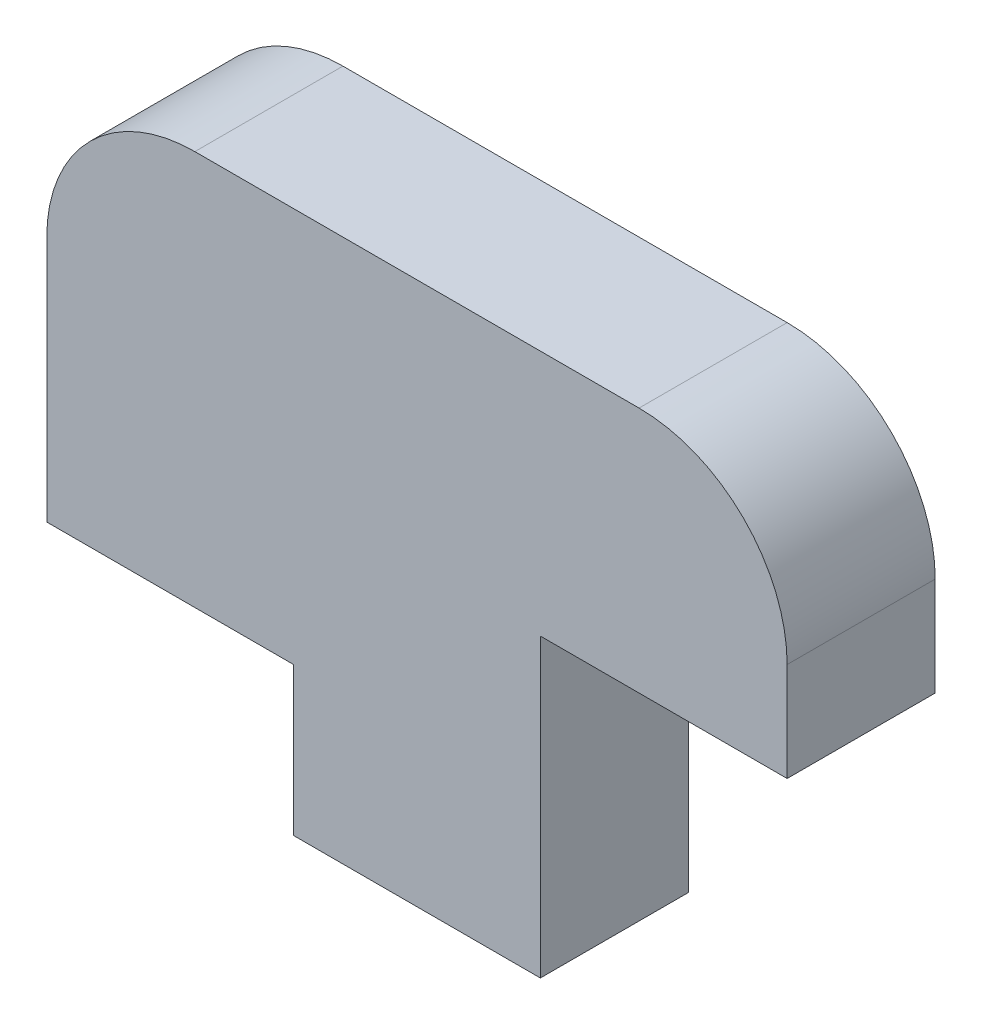
ISO-10303-21;
HEADER;
FILE_DESCRIPTION(('STEP AP214'),'2;1');
FILE_NAME('part.step','',(''),(''),'','','');
FILE_SCHEMA(('AUTOMOTIVE_DESIGN { 1 0 10303 214 1 1 1 1 }'));
ENDSEC;
DATA;
#1=APPLICATION_CONTEXT('core data for automotive mechanical design processes');
#2=APPLICATION_PROTOCOL_DEFINITION('international standard','automotive_design',2000,#1);
#3=PRODUCT_CONTEXT('',#1,'mechanical');
#4=PRODUCT('Part','Part','',(#3));
#5=PRODUCT_RELATED_PRODUCT_CATEGORY('part','',(#4));
#6=PRODUCT_DEFINITION_FORMATION('','',#4);
#7=PRODUCT_DEFINITION_CONTEXT('part definition',#1,'design');
#8=PRODUCT_DEFINITION('design','',#6,#7);
#9=PRODUCT_DEFINITION_SHAPE('','',#8);
#10=(LENGTH_UNIT() NAMED_UNIT(*) SI_UNIT(.MILLI.,.METRE.));
#11=(NAMED_UNIT(*) PLANE_ANGLE_UNIT() SI_UNIT($,.RADIAN.));
#12=(NAMED_UNIT(*) SI_UNIT($,.STERADIAN.) SOLID_ANGLE_UNIT());
#13=UNCERTAINTY_MEASURE_WITH_UNIT(LENGTH_MEASURE(1.E-05),#10,'distance_accuracy_value','');
#14=(GEOMETRIC_REPRESENTATION_CONTEXT(3) GLOBAL_UNCERTAINTY_ASSIGNED_CONTEXT((#13)) GLOBAL_UNIT_ASSIGNED_CONTEXT((#10,
#11,#12)) REPRESENTATION_CONTEXT('',''));
#15=CARTESIAN_POINT('',(0.,0.,0.));
#16=DIRECTION('',(0.,0.,1.));
#17=DIRECTION('',(1.,0.,0.));
#18=AXIS2_PLACEMENT_3D('',#15,#16,#17);
#19=CARTESIAN_POINT('',(-9.99999999999934,3.,3.));
#20=DIRECTION('',(1.,0.,0.));
#21=DIRECTION('',(0.,0.,-1.));
#22=AXIS2_PLACEMENT_3D('',#19,#20,#21);
#23=PLANE('',#22);
#24=DIRECTION('',(0.,-1.,0.));
#25=VECTOR('',#24,1.);
#26=CARTESIAN_POINT('',(-10.,3.,0.));
#27=LINE('',#26,#25);
#28=CARTESIAN_POINT('',(-10.,8.,0.));
#29=VERTEX_POINT('',#28);
#30=CARTESIAN_POINT('',(-10.,3.,0.));
#31=VERTEX_POINT('',#30);
#32=EDGE_CURVE('E138',#29,#31,#27,.T.);
#33=ORIENTED_EDGE('',*,*,#32,.T.);
#34=DIRECTION('',(0.,0.,-1.));
#35=VECTOR('',#34,1.);
#36=CARTESIAN_POINT('',(-9.99999999999934,3.,3.));
#37=LINE('',#36,#35);
#38=CARTESIAN_POINT('',(-9.99999999999934,3.,3.));
#39=VERTEX_POINT('',#38);
#40=EDGE_CURVE('E11',#39,#31,#37,.T.);
#41=ORIENTED_EDGE('',*,*,#40,.F.);
#42=DIRECTION('',(0.,-1.,0.));
#43=VECTOR('',#42,1.);
#44=CARTESIAN_POINT('',(-9.99999999999934,3.,3.));
#45=LINE('',#44,#43);
#46=CARTESIAN_POINT('',(-9.99999999999934,8.,3.));
#47=VERTEX_POINT('',#46);
#48=EDGE_CURVE('E156',#47,#39,#45,.T.);
#49=ORIENTED_EDGE('',*,*,#48,.F.);
#50=DIRECTION('',(0.,0.,-1.));
#51=VECTOR('',#50,1.);
#52=CARTESIAN_POINT('',(-9.99999999999934,8.,3.));
#53=LINE('',#52,#51);
#54=EDGE_CURVE('E134',#47,#29,#53,.T.);
#55=ORIENTED_EDGE('',*,*,#54,.T.);
#56=EDGE_LOOP('',(#33,#41,#49,#55));
#57=FACE_BOUND('',#56,.T.);
#58=ADVANCED_FACE('F30',(#57),#23,.F.);
#59=CARTESIAN_POINT('',(-9.99999999999934,3.,3.));
#60=DIRECTION('',(0.,1.,0.));
#61=DIRECTION('',(-1.,0.,0.));
#62=AXIS2_PLACEMENT_3D('',#59,#60,#61);
#63=PLANE('',#62);
#64=DIRECTION('',(1.,0.,0.));
#65=VECTOR('',#64,1.);
#66=CARTESIAN_POINT('',(-10.,3.,0.));
#67=LINE('',#66,#65);
#68=CARTESIAN_POINT('',(-4.99999999999989,3.,0.));
#69=VERTEX_POINT('',#68);
#70=EDGE_CURVE('E141',#31,#69,#67,.T.);
#71=ORIENTED_EDGE('',*,*,#70,.T.);
#72=DIRECTION('',(0.,0.,-1.));
#73=VECTOR('',#72,1.);
#74=CARTESIAN_POINT('',(-4.99999999999945,3.,3.));
#75=LINE('',#74,#73);
#76=CARTESIAN_POINT('',(-4.99999999999945,3.,3.));
#77=VERTEX_POINT('',#76);
#78=EDGE_CURVE('E38',#77,#69,#75,.T.);
#79=ORIENTED_EDGE('',*,*,#78,.F.);
#80=DIRECTION('',(1.,0.,0.));
#81=VECTOR('',#80,1.);
#82=CARTESIAN_POINT('',(-9.99999999999934,3.,3.));
#83=LINE('',#82,#81);
#84=EDGE_CURVE('E95',#39,#77,#83,.T.);
#85=ORIENTED_EDGE('',*,*,#84,.F.);
#86=ORIENTED_EDGE('',*,*,#40,.T.);
#87=EDGE_LOOP('',(#71,#79,#85,#86));
#88=FACE_BOUND('',#87,.T.);
#89=ADVANCED_FACE('F205',(#88),#63,.F.);
#90=CARTESIAN_POINT('',(-4.99999999999945,3.,3.));
#91=DIRECTION('',(1.,0.,0.));
#92=DIRECTION('',(0.,0.,-1.));
#93=AXIS2_PLACEMENT_3D('',#90,#91,#92);
#94=PLANE('',#93);
#95=DIRECTION('',(0.,-1.,0.));
#96=VECTOR('',#95,1.);
#97=CARTESIAN_POINT('',(-4.99999999999989,3.,0.));
#98=LINE('',#97,#96);
#99=CARTESIAN_POINT('',(-4.99999999999989,0.,0.));
#100=VERTEX_POINT('',#99);
#101=EDGE_CURVE('E143',#69,#100,#98,.T.);
#102=ORIENTED_EDGE('',*,*,#101,.T.);
#103=DIRECTION('',(0.,0.,-1.));
#104=VECTOR('',#103,1.);
#105=CARTESIAN_POINT('',(-4.99999999999945,0.,3.));
#106=LINE('',#105,#104);
#107=CARTESIAN_POINT('',(-4.99999999999945,0.,3.));
#108=VERTEX_POINT('',#107);
#109=EDGE_CURVE('E169',#108,#100,#106,.T.);
#110=ORIENTED_EDGE('',*,*,#109,.F.);
#111=DIRECTION('',(0.,-1.,0.));
#112=VECTOR('',#111,1.);
#113=CARTESIAN_POINT('',(-4.99999999999945,3.,3.));
#114=LINE('',#113,#112);
#115=EDGE_CURVE('E177',#77,#108,#114,.T.);
#116=ORIENTED_EDGE('',*,*,#115,.F.);
#117=ORIENTED_EDGE('',*,*,#78,.T.);
#118=EDGE_LOOP('',(#102,#110,#116,#117));
#119=FACE_BOUND('',#118,.T.);
#120=ADVANCED_FACE('F175',(#119),#94,.F.);
#121=CARTESIAN_POINT('',(-4.99999999999945,0.,3.));
#122=DIRECTION('',(0.,1.,0.));
#123=DIRECTION('',(0.,0.,1.));
#124=AXIS2_PLACEMENT_3D('',#121,#122,#123);
#125=PLANE('',#124);
#126=DIRECTION('',(1.,0.,0.));
#127=VECTOR('',#126,1.);
#128=CARTESIAN_POINT('',(-4.99999999999989,0.,0.));
#129=LINE('',#128,#127);
#130=CARTESIAN_POINT('',(0.,0.,0.));
#131=VERTEX_POINT('',#130);
#132=EDGE_CURVE('E145',#100,#131,#129,.T.);
#133=ORIENTED_EDGE('',*,*,#132,.T.);
#134=DIRECTION('',(0.,0.,-1.));
#135=VECTOR('',#134,1.);
#136=CARTESIAN_POINT('',(6.66133814775094E-13,0.,3.));
#137=LINE('',#136,#135);
#138=CARTESIAN_POINT('',(6.66133814775094E-13,0.,3.));
#139=VERTEX_POINT('',#138);
#140=EDGE_CURVE('E166',#139,#131,#137,.T.);
#141=ORIENTED_EDGE('',*,*,#140,.F.);
#142=DIRECTION('',(1.,0.,0.));
#143=VECTOR('',#142,1.);
#144=CARTESIAN_POINT('',(-4.99999999999945,0.,3.));
#145=LINE('',#144,#143);
#146=EDGE_CURVE('E195',#108,#139,#145,.T.);
#147=ORIENTED_EDGE('',*,*,#146,.F.);
#148=ORIENTED_EDGE('',*,*,#109,.T.);
#149=EDGE_LOOP('',(#133,#141,#147,#148));
#150=FACE_BOUND('',#149,.T.);
#151=ADVANCED_FACE('F186',(#150),#125,.F.);
#152=CARTESIAN_POINT('',(6.66133814775094E-13,0.,3.));
#153=DIRECTION('',(-1.,0.,0.));
#154=DIRECTION('',(0.,0.,1.));
#155=AXIS2_PLACEMENT_3D('',#152,#153,#154);
#156=PLANE('',#155);
#157=DIRECTION('',(0.,1.,0.));
#158=VECTOR('',#157,1.);
#159=CARTESIAN_POINT('',(0.,0.,0.));
#160=LINE('',#159,#158);
#161=CARTESIAN_POINT('',(0.,6.,0.));
#162=VERTEX_POINT('',#161);
#163=EDGE_CURVE('E147',#131,#162,#160,.T.);
#164=ORIENTED_EDGE('',*,*,#163,.T.);
#165=DIRECTION('',(0.,0.,-1.));
#166=VECTOR('',#165,1.);
#167=CARTESIAN_POINT('',(6.66133814775094E-13,6.,3.));
#168=LINE('',#167,#166);
#169=CARTESIAN_POINT('',(6.66133814775094E-13,6.,3.));
#170=VERTEX_POINT('',#169);
#171=EDGE_CURVE('E163',#170,#162,#168,.T.);
#172=ORIENTED_EDGE('',*,*,#171,.F.);
#173=DIRECTION('',(0.,1.,0.));
#174=VECTOR('',#173,1.);
#175=CARTESIAN_POINT('',(6.66133814775094E-13,0.,3.));
#176=LINE('',#175,#174);
#177=EDGE_CURVE('E192',#139,#170,#176,.T.);
#178=ORIENTED_EDGE('',*,*,#177,.F.);
#179=ORIENTED_EDGE('',*,*,#140,.T.);
#180=EDGE_LOOP('',(#164,#172,#178,#179));
#181=FACE_BOUND('',#180,.T.);
#182=ADVANCED_FACE('F190',(#181),#156,.F.);
#183=CARTESIAN_POINT('',(6.66133814775094E-13,6.,3.));
#184=DIRECTION('',(0.,1.,0.));
#185=DIRECTION('',(0.,0.,1.));
#186=AXIS2_PLACEMENT_3D('',#183,#184,#185);
#187=PLANE('',#186);
#188=DIRECTION('',(1.,0.,0.));
#189=VECTOR('',#188,1.);
#190=CARTESIAN_POINT('',(0.,6.,0.));
#191=LINE('',#190,#189);
#192=CARTESIAN_POINT('',(4.99999999999989,6.,0.));
#193=VERTEX_POINT('',#192);
#194=EDGE_CURVE('E149',#162,#193,#191,.T.);
#195=ORIENTED_EDGE('',*,*,#194,.T.);
#196=DIRECTION('',(0.,0.,-1.));
#197=VECTOR('',#196,1.);
#198=CARTESIAN_POINT('',(5.00000000000056,6.,3.));
#199=LINE('',#198,#197);
#200=CARTESIAN_POINT('',(5.00000000000056,6.,3.));
#201=VERTEX_POINT('',#200);
#202=EDGE_CURVE('E160',#201,#193,#199,.T.);
#203=ORIENTED_EDGE('',*,*,#202,.F.);
#204=DIRECTION('',(1.,0.,0.));
#205=VECTOR('',#204,1.);
#206=CARTESIAN_POINT('',(6.66133814775094E-13,6.,3.));
#207=LINE('',#206,#205);
#208=EDGE_CURVE('E194',#170,#201,#207,.T.);
#209=ORIENTED_EDGE('',*,*,#208,.F.);
#210=ORIENTED_EDGE('',*,*,#171,.T.);
#211=EDGE_LOOP('',(#195,#203,#209,#210));
#212=FACE_BOUND('',#211,.T.);
#213=ADVANCED_FACE('F217',(#212),#187,.F.);
#214=CARTESIAN_POINT('',(5.00000000000056,6.,3.));
#215=DIRECTION('',(-1.,0.,0.));
#216=DIRECTION('',(0.,0.,1.));
#217=AXIS2_PLACEMENT_3D('',#214,#215,#216);
#218=PLANE('',#217);
#219=DIRECTION('',(0.,1.,0.));
#220=VECTOR('',#219,1.);
#221=CARTESIAN_POINT('',(4.99999999999989,6.,0.));
#222=LINE('',#221,#220);
#223=CARTESIAN_POINT('',(4.99999999999989,8.,0.));
#224=VERTEX_POINT('',#223);
#225=EDGE_CURVE('E151',#193,#224,#222,.T.);
#226=ORIENTED_EDGE('',*,*,#225,.T.);
#227=DIRECTION('',(0.,0.,-1.));
#228=VECTOR('',#227,1.);
#229=CARTESIAN_POINT('',(5.00000000000056,8.,3.));
#230=LINE('',#229,#228);
#231=CARTESIAN_POINT('',(5.00000000000056,8.,3.));
#232=VERTEX_POINT('',#231);
#233=EDGE_CURVE('E129',#232,#224,#230,.T.);
#234=ORIENTED_EDGE('',*,*,#233,.F.);
#235=DIRECTION('',(0.,1.,0.));
#236=VECTOR('',#235,1.);
#237=CARTESIAN_POINT('',(5.00000000000056,6.,3.));
#238=LINE('',#237,#236);
#239=EDGE_CURVE('E120',#201,#232,#238,.T.);
#240=ORIENTED_EDGE('',*,*,#239,.F.);
#241=ORIENTED_EDGE('',*,*,#202,.T.);
#242=EDGE_LOOP('',(#226,#234,#240,#241));
#243=FACE_BOUND('',#242,.T.);
#244=ADVANCED_FACE('F220',(#243),#218,.F.);
#245=CARTESIAN_POINT('',(2.00000000000067,8.,3.));
#246=DIRECTION('',(0.,0.,-1.));
#247=DIRECTION('',(-1.,0.,0.));
#248=AXIS2_PLACEMENT_3D('',#245,#246,#247);
#249=CYLINDRICAL_SURFACE('',#248,3.);
#250=CARTESIAN_POINT('',(2.,8.,0.));
#251=DIRECTION('',(0.,0.,1.));
#252=DIRECTION('',(1.,0.,0.));
#253=AXIS2_PLACEMENT_3D('',#250,#251,#252);
#254=CIRCLE('',#253,3.);
#255=CARTESIAN_POINT('',(2.,11.,0.));
#256=VERTEX_POINT('',#255);
#257=EDGE_CURVE('E128',#224,#256,#254,.T.);
#258=ORIENTED_EDGE('',*,*,#257,.T.);
#259=DIRECTION('',(0.,0.,-1.));
#260=VECTOR('',#259,1.);
#261=CARTESIAN_POINT('',(2.00000000000067,11.,3.));
#262=LINE('',#261,#260);
#263=CARTESIAN_POINT('',(2.00000000000067,11.,3.));
#264=VERTEX_POINT('',#263);
#265=EDGE_CURVE('E125',#264,#256,#262,.T.);
#266=ORIENTED_EDGE('',*,*,#265,.F.);
#267=CARTESIAN_POINT('',(2.00000000000067,8.,3.));
#268=DIRECTION('',(0.,0.,1.));
#269=DIRECTION('',(1.,0.,0.));
#270=AXIS2_PLACEMENT_3D('',#267,#268,#269);
#271=CIRCLE('',#270,3.);
#272=EDGE_CURVE('E114',#232,#264,#271,.T.);
#273=ORIENTED_EDGE('',*,*,#272,.F.);
#274=ORIENTED_EDGE('',*,*,#233,.T.);
#275=EDGE_LOOP('',(#258,#266,#273,#274));
#276=FACE_BOUND('',#275,.T.);
#277=ADVANCED_FACE('F126',(#276),#249,.T.);
#278=CARTESIAN_POINT('',(-6.99999999999945,11.,3.00000000000004));
#279=DIRECTION('',(0.,-1.,0.));
#280=DIRECTION('',(0.,0.,-1.));
#281=AXIS2_PLACEMENT_3D('',#278,#279,#280);
#282=PLANE('',#281);
#283=DIRECTION('',(-1.,0.,0.));
#284=VECTOR('',#283,1.);
#285=CARTESIAN_POINT('',(-6.9999999999999,11.,0.));
#286=LINE('',#285,#284);
#287=CARTESIAN_POINT('',(-6.9999999999999,11.,0.));
#288=VERTEX_POINT('',#287);
#289=EDGE_CURVE('E81',#256,#288,#286,.T.);
#290=ORIENTED_EDGE('',*,*,#289,.T.);
#291=DIRECTION('',(0.,0.,-1.));
#292=VECTOR('',#291,1.);
#293=CARTESIAN_POINT('',(-6.99999999999945,11.,3.00000000000004));
#294=LINE('',#293,#292);
#295=CARTESIAN_POINT('',(-6.99999999999945,11.,3.00000000000004));
#296=VERTEX_POINT('',#295);
#297=EDGE_CURVE('E130',#296,#288,#294,.T.);
#298=ORIENTED_EDGE('',*,*,#297,.F.);
#299=DIRECTION('',(-1.,0.,0.));
#300=VECTOR('',#299,1.);
#301=CARTESIAN_POINT('',(-6.99999999999945,11.,3.00000000000004));
#302=LINE('',#301,#300);
#303=EDGE_CURVE('E118',#264,#296,#302,.T.);
#304=ORIENTED_EDGE('',*,*,#303,.F.);
#305=ORIENTED_EDGE('',*,*,#265,.T.);
#306=EDGE_LOOP('',(#290,#298,#304,#305));
#307=FACE_BOUND('',#306,.T.);
#308=ADVANCED_FACE('F132',(#307),#282,.F.);
#309=CARTESIAN_POINT('',(-6.99999999999945,8.,3.00000000000004));
#310=DIRECTION('',(0.,0.,-1.));
#311=DIRECTION('',(-1.,0.,0.));
#312=AXIS2_PLACEMENT_3D('',#309,#310,#311);
#313=CYLINDRICAL_SURFACE('',#312,3.);
#314=CARTESIAN_POINT('',(-6.9999999999999,8.,0.));
#315=DIRECTION('',(0.,0.,1.));
#316=DIRECTION('',(-1.,0.,0.));
#317=AXIS2_PLACEMENT_3D('',#314,#315,#316);
#318=CIRCLE('',#317,3.);
#319=EDGE_CURVE('E87',#288,#29,#318,.T.);
#320=ORIENTED_EDGE('',*,*,#319,.T.);
#321=ORIENTED_EDGE('',*,*,#54,.F.);
#322=CARTESIAN_POINT('',(-6.99999999999945,8.,3.00000000000004));
#323=DIRECTION('',(0.,0.,1.));
#324=DIRECTION('',(-1.,0.,0.));
#325=AXIS2_PLACEMENT_3D('',#322,#323,#324);
#326=CIRCLE('',#325,3.);
#327=EDGE_CURVE('E46',#296,#47,#326,.T.);
#328=ORIENTED_EDGE('',*,*,#327,.F.);
#329=ORIENTED_EDGE('',*,*,#297,.T.);
#330=EDGE_LOOP('',(#320,#321,#328,#329));
#331=FACE_BOUND('',#330,.T.);
#332=ADVANCED_FACE('F229',(#331),#313,.T.);
#333=CARTESIAN_POINT('',(-6.99999999999945,8.,3.00000000000004));
#334=DIRECTION('',(0.,0.,-1.));
#335=DIRECTION('',(-1.,0.,0.));
#336=AXIS2_PLACEMENT_3D('',#333,#334,#335);
#337=PLANE('',#336);
#338=ORIENTED_EDGE('',*,*,#48,.T.);
#339=ORIENTED_EDGE('',*,*,#84,.T.);
#340=ORIENTED_EDGE('',*,*,#115,.T.);
#341=ORIENTED_EDGE('',*,*,#146,.T.);
#342=ORIENTED_EDGE('',*,*,#177,.T.);
#343=ORIENTED_EDGE('',*,*,#208,.T.);
#344=ORIENTED_EDGE('',*,*,#239,.T.);
#345=ORIENTED_EDGE('',*,*,#272,.T.);
#346=ORIENTED_EDGE('',*,*,#303,.T.);
#347=ORIENTED_EDGE('',*,*,#327,.T.);
#348=EDGE_LOOP('',(#338,#339,#340,#341,#342,#343,#344,#345,#346,#347));
#349=FACE_BOUND('',#348,.T.);
#350=ADVANCED_FACE('F116',(#349),#337,.F.);
#351=CARTESIAN_POINT('',(-6.9999999999999,8.,0.));
#352=DIRECTION('',(0.,0.,-1.));
#353=DIRECTION('',(-1.,0.,0.));
#354=AXIS2_PLACEMENT_3D('',#351,#352,#353);
#355=PLANE('',#354);
#356=ORIENTED_EDGE('',*,*,#32,.F.);
#357=ORIENTED_EDGE('',*,*,#319,.F.);
#358=ORIENTED_EDGE('',*,*,#289,.F.);
#359=ORIENTED_EDGE('',*,*,#257,.F.);
#360=ORIENTED_EDGE('',*,*,#225,.F.);
#361=ORIENTED_EDGE('',*,*,#194,.F.);
#362=ORIENTED_EDGE('',*,*,#163,.F.);
#363=ORIENTED_EDGE('',*,*,#132,.F.);
#364=ORIENTED_EDGE('',*,*,#101,.F.);
#365=ORIENTED_EDGE('',*,*,#70,.F.);
#366=EDGE_LOOP('',(#356,#357,#358,#359,#360,#361,#362,#363,#364,#365));
#367=FACE_BOUND('',#366,.T.);
#368=ADVANCED_FACE('F181',(#367),#355,.T.);
#369=CLOSED_SHELL('',(#58,#89,#120,#151,#182,#213,#244,#277,#308,#332,#350,#368));
#370=MANIFOLD_SOLID_BREP('B2',#369);
#371=ADVANCED_BREP_SHAPE_REPRESENTATION('',(#18,#370),#14);
#372=SHAPE_DEFINITION_REPRESENTATION(#9,#371);
ENDSEC;
END-ISO-10303-21;
